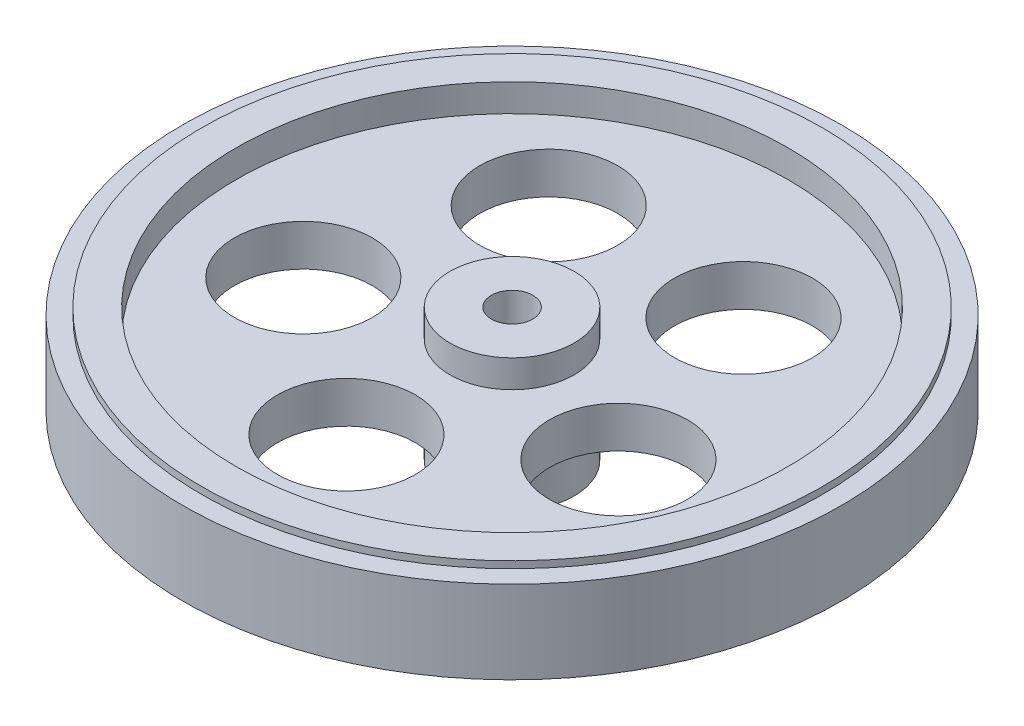
ISO-10303-21;
HEADER;
FILE_DESCRIPTION(('STEP AP214'),'2;1');
FILE_NAME('part.step','',(''),(''),'','','');
FILE_SCHEMA(('AUTOMOTIVE_DESIGN { 1 0 10303 214 1 1 1 1 }'));
ENDSEC;
DATA;
#1=APPLICATION_CONTEXT('core data for automotive mechanical design processes');
#2=APPLICATION_PROTOCOL_DEFINITION('international standard','automotive_design',2000,#1);
#3=PRODUCT_CONTEXT('',#1,'mechanical');
#4=PRODUCT('Part','Part','',(#3));
#5=PRODUCT_RELATED_PRODUCT_CATEGORY('part','',(#4));
#6=PRODUCT_DEFINITION_FORMATION('','',#4);
#7=PRODUCT_DEFINITION_CONTEXT('part definition',#1,'design');
#8=PRODUCT_DEFINITION('design','',#6,#7);
#9=PRODUCT_DEFINITION_SHAPE('','',#8);
#10=(LENGTH_UNIT() NAMED_UNIT(*) SI_UNIT(.MILLI.,.METRE.));
#11=(NAMED_UNIT(*) PLANE_ANGLE_UNIT() SI_UNIT($,.RADIAN.));
#12=(NAMED_UNIT(*) SI_UNIT($,.STERADIAN.) SOLID_ANGLE_UNIT());
#13=UNCERTAINTY_MEASURE_WITH_UNIT(LENGTH_MEASURE(1.E-05),#10,'distance_accuracy_value','');
#14=(GEOMETRIC_REPRESENTATION_CONTEXT(3) GLOBAL_UNCERTAINTY_ASSIGNED_CONTEXT((#13)) GLOBAL_UNIT_ASSIGNED_CONTEXT((#10,
#11,#12)) REPRESENTATION_CONTEXT('',''));
#15=CARTESIAN_POINT('',(0.,0.,0.));
#16=DIRECTION('',(0.,0.,1.));
#17=DIRECTION('',(1.,0.,0.));
#18=AXIS2_PLACEMENT_3D('',#15,#16,#17);
#19=CARTESIAN_POINT('',(-40.,33.92105263158,0.));
#20=DIRECTION('',(0.,-1.,0.));
#21=DIRECTION('',(0.,0.,-1.));
#22=AXIS2_PLACEMENT_3D('',#19,#20,#21);
#23=PLANE('',#22);
#24=CARTESIAN_POINT('',(0.,33.92105263158,0.));
#25=DIRECTION('',(0.,-1.,0.));
#26=DIRECTION('',(0.,0.,-1.));
#27=AXIS2_PLACEMENT_3D('',#24,#25,#26);
#28=CIRCLE('',#27,45.);
#29=CARTESIAN_POINT('',(0.,33.92105263158,-45.));
#30=VERTEX_POINT('',#29);
#31=EDGE_CURVE('E10',#30,#30,#28,.T.);
#32=ORIENTED_EDGE('',*,*,#31,.F.);
#33=EDGE_LOOP('',(#32));
#34=FACE_BOUND('',#33,.T.);
#35=CARTESIAN_POINT('',(0.,33.92105263158,0.));
#36=DIRECTION('',(0.,-1.,0.));
#37=DIRECTION('',(0.,0.,-1.));
#38=AXIS2_PLACEMENT_3D('',#35,#36,#37);
#39=CIRCLE('',#38,40.);
#40=CARTESIAN_POINT('',(0.,33.92105263158,-40.));
#41=VERTEX_POINT('',#40);
#42=EDGE_CURVE('E70',#41,#41,#39,.T.);
#43=ORIENTED_EDGE('',*,*,#42,.T.);
#44=EDGE_LOOP('',(#43));
#45=FACE_BOUND('',#44,.T.);
#46=ADVANCED_FACE('F40',(#34,#45),#23,.F.);
#47=CARTESIAN_POINT('',(0.,0.,0.));
#48=DIRECTION('',(0.,-1.,0.));
#49=DIRECTION('',(0.,0.,-1.));
#50=AXIS2_PLACEMENT_3D('',#47,#48,#49);
#51=CYLINDRICAL_SURFACE('',#50,45.);
#52=CARTESIAN_POINT('',(0.,32.92105263158,0.));
#53=DIRECTION('',(0.,-1.,0.));
#54=DIRECTION('',(0.,0.,-1.));
#55=AXIS2_PLACEMENT_3D('',#52,#53,#54);
#56=CIRCLE('',#55,45.);
#57=CARTESIAN_POINT('',(0.,32.92105263158,-45.));
#58=VERTEX_POINT('',#57);
#59=EDGE_CURVE('E47',#58,#58,#56,.T.);
#60=ORIENTED_EDGE('',*,*,#59,.F.);
#61=EDGE_LOOP('',(#60));
#62=FACE_BOUND('',#61,.T.);
#63=ORIENTED_EDGE('',*,*,#31,.T.);
#64=EDGE_LOOP('',(#63));
#65=FACE_BOUND('',#64,.T.);
#66=ADVANCED_FACE('F123',(#62,#65),#51,.T.);
#67=CARTESIAN_POINT('',(-45.,32.92105263158,0.));
#68=DIRECTION('',(0.,-1.,0.));
#69=DIRECTION('',(0.,0.,-1.));
#70=AXIS2_PLACEMENT_3D('',#67,#68,#69);
#71=PLANE('',#70);
#72=CARTESIAN_POINT('',(0.,32.92105263158,0.));
#73=DIRECTION('',(0.,-1.,0.));
#74=DIRECTION('',(0.,0.,-1.));
#75=AXIS2_PLACEMENT_3D('',#72,#73,#74);
#76=CIRCLE('',#75,47.75);
#77=CARTESIAN_POINT('',(0.,32.92105263158,-47.75));
#78=VERTEX_POINT('',#77);
#79=EDGE_CURVE('E52',#78,#78,#76,.T.);
#80=ORIENTED_EDGE('',*,*,#79,.F.);
#81=EDGE_LOOP('',(#80));
#82=FACE_BOUND('',#81,.T.);
#83=ORIENTED_EDGE('',*,*,#59,.T.);
#84=EDGE_LOOP('',(#83));
#85=FACE_BOUND('',#84,.T.);
#86=ADVANCED_FACE('F120',(#82,#85),#71,.F.);
#87=CARTESIAN_POINT('',(0.,0.,0.));
#88=DIRECTION('',(0.,-1.,0.));
#89=DIRECTION('',(0.,0.,-1.));
#90=AXIS2_PLACEMENT_3D('',#87,#88,#89);
#91=CYLINDRICAL_SURFACE('',#90,47.75);
#92=CARTESIAN_POINT('',(0.,20.92105263158,0.));
#93=DIRECTION('',(0.,-1.,0.));
#94=DIRECTION('',(0.,0.,-1.));
#95=AXIS2_PLACEMENT_3D('',#92,#93,#94);
#96=CIRCLE('',#95,47.75);
#97=CARTESIAN_POINT('',(0.,20.92105263158,-47.75));
#98=VERTEX_POINT('',#97);
#99=EDGE_CURVE('E113',#98,#98,#96,.T.);
#100=ORIENTED_EDGE('',*,*,#99,.F.);
#101=EDGE_LOOP('',(#100));
#102=FACE_BOUND('',#101,.T.);
#103=ORIENTED_EDGE('',*,*,#79,.T.);
#104=EDGE_LOOP('',(#103));
#105=FACE_BOUND('',#104,.T.);
#106=ADVANCED_FACE('F118',(#102,#105),#91,.T.);
#107=CARTESIAN_POINT('',(-47.75,20.92105263158,0.));
#108=DIRECTION('',(0.,1.,0.));
#109=DIRECTION('',(0.,0.,1.));
#110=AXIS2_PLACEMENT_3D('',#107,#108,#109);
#111=PLANE('',#110);
#112=CARTESIAN_POINT('',(0.,20.92105263158,0.));
#113=DIRECTION('',(0.,-1.,0.));
#114=DIRECTION('',(0.,0.,-1.));
#115=AXIS2_PLACEMENT_3D('',#112,#113,#114);
#116=CIRCLE('',#115,45.);
#117=CARTESIAN_POINT('',(0.,20.92105263158,-45.));
#118=VERTEX_POINT('',#117);
#119=EDGE_CURVE('E110',#118,#118,#116,.T.);
#120=ORIENTED_EDGE('',*,*,#119,.F.);
#121=EDGE_LOOP('',(#120));
#122=FACE_BOUND('',#121,.T.);
#123=ORIENTED_EDGE('',*,*,#99,.T.);
#124=EDGE_LOOP('',(#123));
#125=FACE_BOUND('',#124,.T.);
#126=ADVANCED_FACE('F135',(#122,#125),#111,.F.);
#127=CARTESIAN_POINT('',(0.,0.,0.));
#128=DIRECTION('',(0.,-1.,0.));
#129=DIRECTION('',(0.,0.,-1.));
#130=AXIS2_PLACEMENT_3D('',#127,#128,#129);
#131=CYLINDRICAL_SURFACE('',#130,45.);
#132=CARTESIAN_POINT('',(0.,19.92105263158,0.));
#133=DIRECTION('',(0.,-1.,0.));
#134=DIRECTION('',(0.,0.,-1.));
#135=AXIS2_PLACEMENT_3D('',#132,#133,#134);
#136=CIRCLE('',#135,45.);
#137=CARTESIAN_POINT('',(0.,19.92105263158,-45.));
#138=VERTEX_POINT('',#137);
#139=EDGE_CURVE('E107',#138,#138,#136,.T.);
#140=ORIENTED_EDGE('',*,*,#139,.F.);
#141=EDGE_LOOP('',(#140));
#142=FACE_BOUND('',#141,.T.);
#143=ORIENTED_EDGE('',*,*,#119,.T.);
#144=EDGE_LOOP('',(#143));
#145=FACE_BOUND('',#144,.T.);
#146=ADVANCED_FACE('F139',(#142,#145),#131,.T.);
#147=CARTESIAN_POINT('',(-45.,19.92105263158,0.));
#148=DIRECTION('',(0.,1.,0.));
#149=DIRECTION('',(0.,0.,1.));
#150=AXIS2_PLACEMENT_3D('',#147,#148,#149);
#151=PLANE('',#150);
#152=CARTESIAN_POINT('',(0.,19.92105263158,0.));
#153=DIRECTION('',(0.,-1.,0.));
#154=DIRECTION('',(0.,0.,-1.));
#155=AXIS2_PLACEMENT_3D('',#152,#153,#154);
#156=CIRCLE('',#155,40.);
#157=CARTESIAN_POINT('',(0.,19.92105263158,-40.));
#158=VERTEX_POINT('',#157);
#159=EDGE_CURVE('E104',#158,#158,#156,.T.);
#160=ORIENTED_EDGE('',*,*,#159,.F.);
#161=EDGE_LOOP('',(#160));
#162=FACE_BOUND('',#161,.T.);
#163=ORIENTED_EDGE('',*,*,#139,.T.);
#164=EDGE_LOOP('',(#163));
#165=FACE_BOUND('',#164,.T.);
#166=ADVANCED_FACE('F143',(#162,#165),#151,.F.);
#167=CARTESIAN_POINT('',(0.,0.,0.));
#168=DIRECTION('',(0.,-1.,0.));
#169=DIRECTION('',(0.,0.,-1.));
#170=AXIS2_PLACEMENT_3D('',#167,#168,#169);
#171=CYLINDRICAL_SURFACE('',#170,40.);
#172=CARTESIAN_POINT('',(0.,23.92105263158,0.));
#173=DIRECTION('',(0.,-1.,0.));
#174=DIRECTION('',(0.,0.,-1.));
#175=AXIS2_PLACEMENT_3D('',#172,#173,#174);
#176=CIRCLE('',#175,40.);
#177=CARTESIAN_POINT('',(0.,23.92105263158,-40.));
#178=VERTEX_POINT('',#177);
#179=EDGE_CURVE('E101',#178,#178,#176,.T.);
#180=ORIENTED_EDGE('',*,*,#179,.F.);
#181=EDGE_LOOP('',(#180));
#182=FACE_BOUND('',#181,.T.);
#183=ORIENTED_EDGE('',*,*,#159,.T.);
#184=EDGE_LOOP('',(#183));
#185=FACE_BOUND('',#184,.T.);
#186=ADVANCED_FACE('F147',(#182,#185),#171,.F.);
#187=CARTESIAN_POINT('',(-40.,23.92105263158,0.));
#188=DIRECTION('',(0.,1.,0.));
#189=DIRECTION('',(0.,0.,1.));
#190=AXIS2_PLACEMENT_3D('',#187,#188,#189);
#191=PLANE('',#190);
#192=CARTESIAN_POINT('',(-22.8253563910837,23.92105263158,7.41640786499874));
#193=DIRECTION('',(0.,-1.,0.));
#194=DIRECTION('',(0.,0.,-1.));
#195=AXIS2_PLACEMENT_3D('',#192,#193,#194);
#196=CIRCLE('',#195,10.);
#197=CARTESIAN_POINT('',(-22.8253563910837,23.92105263158,-2.58359213500126));
#198=VERTEX_POINT('',#197);
#199=EDGE_CURVE('E248',#198,#198,#196,.T.);
#200=ORIENTED_EDGE('',*,*,#199,.F.);
#201=EDGE_LOOP('',(#200));
#202=FACE_BOUND('',#201,.T.);
#203=CARTESIAN_POINT('',(-14.1068460550194,23.92105263158,-19.4164078649987));
#204=DIRECTION('',(0.,-1.,0.));
#205=DIRECTION('',(0.,0.,-1.));
#206=AXIS2_PLACEMENT_3D('',#203,#204,#205);
#207=CIRCLE('',#206,10.);
#208=CARTESIAN_POINT('',(-14.1068460550194,23.92105263158,-29.4164078649987));
#209=VERTEX_POINT('',#208);
#210=EDGE_CURVE('E244',#209,#209,#207,.T.);
#211=ORIENTED_EDGE('',*,*,#210,.F.);
#212=EDGE_LOOP('',(#211));
#213=FACE_BOUND('',#212,.T.);
#214=CARTESIAN_POINT('',(14.1068460550194,23.92105263158,-19.4164078649987));
#215=DIRECTION('',(0.,-1.,0.));
#216=DIRECTION('',(0.,0.,-1.));
#217=AXIS2_PLACEMENT_3D('',#214,#215,#216);
#218=CIRCLE('',#217,10.);
#219=CARTESIAN_POINT('',(14.1068460550194,23.92105263158,-29.4164078649987));
#220=VERTEX_POINT('',#219);
#221=EDGE_CURVE('E240',#220,#220,#218,.T.);
#222=ORIENTED_EDGE('',*,*,#221,.F.);
#223=EDGE_LOOP('',(#222));
#224=FACE_BOUND('',#223,.T.);
#225=CARTESIAN_POINT('',(22.8253563910837,23.92105263158,7.41640786499874));
#226=DIRECTION('',(0.,-1.,0.));
#227=DIRECTION('',(0.,0.,-1.));
#228=AXIS2_PLACEMENT_3D('',#225,#226,#227);
#229=CIRCLE('',#228,10.);
#230=CARTESIAN_POINT('',(22.8253563910837,23.92105263158,-2.58359213500127));
#231=VERTEX_POINT('',#230);
#232=EDGE_CURVE('E207',#231,#231,#229,.T.);
#233=ORIENTED_EDGE('',*,*,#232,.F.);
#234=EDGE_LOOP('',(#233));
#235=FACE_BOUND('',#234,.T.);
#236=CARTESIAN_POINT('',(0.,23.92105263158,24.));
#237=DIRECTION('',(0.,-1.,0.));
#238=DIRECTION('',(0.,0.,-1.));
#239=AXIS2_PLACEMENT_3D('',#236,#237,#238);
#240=CIRCLE('',#239,10.);
#241=CARTESIAN_POINT('',(0.,23.92105263158,14.));
#242=VERTEX_POINT('',#241);
#243=EDGE_CURVE('E60',#242,#242,#240,.T.);
#244=ORIENTED_EDGE('',*,*,#243,.F.);
#245=EDGE_LOOP('',(#244));
#246=FACE_BOUND('',#245,.T.);
#247=CARTESIAN_POINT('',(0.,23.92105263158,0.));
#248=DIRECTION('',(0.,-1.,0.));
#249=DIRECTION('',(0.,0.,-1.));
#250=AXIS2_PLACEMENT_3D('',#247,#248,#249);
#251=CIRCLE('',#250,9.);
#252=CARTESIAN_POINT('',(0.,23.92105263158,-9.));
#253=VERTEX_POINT('',#252);
#254=EDGE_CURVE('E98',#253,#253,#251,.T.);
#255=ORIENTED_EDGE('',*,*,#254,.F.);
#256=EDGE_LOOP('',(#255));
#257=FACE_BOUND('',#256,.T.);
#258=ORIENTED_EDGE('',*,*,#179,.T.);
#259=EDGE_LOOP('',(#258));
#260=FACE_BOUND('',#259,.T.);
#261=ADVANCED_FACE('F151',(#202,#213,#224,#235,#246,#257,#260),#191,.F.);
#262=CARTESIAN_POINT('',(0.,0.,0.));
#263=DIRECTION('',(0.,-1.,0.));
#264=DIRECTION('',(0.,0.,-1.));
#265=AXIS2_PLACEMENT_3D('',#262,#263,#264);
#266=CYLINDRICAL_SURFACE('',#265,9.);
#267=CARTESIAN_POINT('',(0.,14.72105263158,0.));
#268=DIRECTION('',(0.,-1.,0.));
#269=DIRECTION('',(0.,0.,-1.));
#270=AXIS2_PLACEMENT_3D('',#267,#268,#269);
#271=CIRCLE('',#270,9.);
#272=CARTESIAN_POINT('',(0.,14.72105263158,-9.));
#273=VERTEX_POINT('',#272);
#274=EDGE_CURVE('E95',#273,#273,#271,.T.);
#275=ORIENTED_EDGE('',*,*,#274,.F.);
#276=EDGE_LOOP('',(#275));
#277=FACE_BOUND('',#276,.T.);
#278=ORIENTED_EDGE('',*,*,#254,.T.);
#279=EDGE_LOOP('',(#278));
#280=FACE_BOUND('',#279,.T.);
#281=ADVANCED_FACE('F155',(#277,#280),#266,.T.);
#282=CARTESIAN_POINT('',(-9.,14.72105263158,0.));
#283=DIRECTION('',(0.,1.,0.));
#284=DIRECTION('',(0.,0.,1.));
#285=AXIS2_PLACEMENT_3D('',#282,#283,#284);
#286=PLANE('',#285);
#287=CARTESIAN_POINT('',(0.,14.72105263158,0.));
#288=DIRECTION('',(0.,-1.,0.));
#289=DIRECTION('',(0.,0.,-1.));
#290=AXIS2_PLACEMENT_3D('',#287,#288,#289);
#291=CIRCLE('',#290,3.);
#292=CARTESIAN_POINT('',(0.,14.72105263158,-3.));
#293=VERTEX_POINT('',#292);
#294=EDGE_CURVE('E92',#293,#293,#291,.T.);
#295=ORIENTED_EDGE('',*,*,#294,.F.);
#296=EDGE_LOOP('',(#295));
#297=FACE_BOUND('',#296,.T.);
#298=ORIENTED_EDGE('',*,*,#274,.T.);
#299=EDGE_LOOP('',(#298));
#300=FACE_BOUND('',#299,.T.);
#301=ADVANCED_FACE('F159',(#297,#300),#286,.F.);
#302=CARTESIAN_POINT('',(0.,0.,0.));
#303=DIRECTION('',(0.,-1.,0.));
#304=DIRECTION('',(0.,0.,-1.));
#305=AXIS2_PLACEMENT_3D('',#302,#303,#304);
#306=CYLINDRICAL_SURFACE('',#305,3.);
#307=CARTESIAN_POINT('',(0.,33.92105263158,0.));
#308=DIRECTION('',(0.,-1.,0.));
#309=DIRECTION('',(0.,0.,-1.));
#310=AXIS2_PLACEMENT_3D('',#307,#308,#309);
#311=CIRCLE('',#310,3.);
#312=CARTESIAN_POINT('',(0.,33.92105263158,-3.));
#313=VERTEX_POINT('',#312);
#314=EDGE_CURVE('E89',#313,#313,#311,.T.);
#315=ORIENTED_EDGE('',*,*,#314,.F.);
#316=EDGE_LOOP('',(#315));
#317=FACE_BOUND('',#316,.T.);
#318=ORIENTED_EDGE('',*,*,#294,.T.);
#319=EDGE_LOOP('',(#318));
#320=FACE_BOUND('',#319,.T.);
#321=ADVANCED_FACE('F163',(#317,#320),#306,.F.);
#322=CARTESIAN_POINT('',(-3.,33.92105263158,0.));
#323=DIRECTION('',(0.,-1.,0.));
#324=DIRECTION('',(0.,0.,-1.));
#325=AXIS2_PLACEMENT_3D('',#322,#323,#324);
#326=PLANE('',#325);
#327=CARTESIAN_POINT('',(0.,33.92105263158,0.));
#328=DIRECTION('',(0.,-1.,0.));
#329=DIRECTION('',(0.,0.,-1.));
#330=AXIS2_PLACEMENT_3D('',#327,#328,#329);
#331=CIRCLE('',#330,9.);
#332=CARTESIAN_POINT('',(0.,33.92105263158,-9.));
#333=VERTEX_POINT('',#332);
#334=EDGE_CURVE('E86',#333,#333,#331,.T.);
#335=ORIENTED_EDGE('',*,*,#334,.F.);
#336=EDGE_LOOP('',(#335));
#337=FACE_BOUND('',#336,.T.);
#338=ORIENTED_EDGE('',*,*,#314,.T.);
#339=EDGE_LOOP('',(#338));
#340=FACE_BOUND('',#339,.T.);
#341=ADVANCED_FACE('F167',(#337,#340),#326,.F.);
#342=CARTESIAN_POINT('',(0.,0.,0.));
#343=DIRECTION('',(0.,-1.,0.));
#344=DIRECTION('',(0.,0.,-1.));
#345=AXIS2_PLACEMENT_3D('',#342,#343,#344);
#346=CYLINDRICAL_SURFACE('',#345,9.);
#347=CARTESIAN_POINT('',(0.,29.92105263158,0.));
#348=DIRECTION('',(0.,-1.,0.));
#349=DIRECTION('',(0.,0.,-1.));
#350=AXIS2_PLACEMENT_3D('',#347,#348,#349);
#351=CIRCLE('',#350,9.);
#352=CARTESIAN_POINT('',(0.,29.92105263158,-9.));
#353=VERTEX_POINT('',#352);
#354=EDGE_CURVE('E79',#353,#353,#351,.T.);
#355=ORIENTED_EDGE('',*,*,#354,.F.);
#356=EDGE_LOOP('',(#355));
#357=FACE_BOUND('',#356,.T.);
#358=ORIENTED_EDGE('',*,*,#334,.T.);
#359=EDGE_LOOP('',(#358));
#360=FACE_BOUND('',#359,.T.);
#361=ADVANCED_FACE('F171',(#357,#360),#346,.T.);
#362=CARTESIAN_POINT('',(-40.,29.92105263158,0.));
#363=DIRECTION('',(0.,-1.,0.));
#364=DIRECTION('',(0.,0.,-1.));
#365=AXIS2_PLACEMENT_3D('',#362,#363,#364);
#366=PLANE('',#365);
#367=CARTESIAN_POINT('',(-22.8253563910837,29.92105263158,7.41640786499874));
#368=DIRECTION('',(0.,-1.,0.));
#369=DIRECTION('',(0.,0.,-1.));
#370=AXIS2_PLACEMENT_3D('',#367,#368,#369);
#371=CIRCLE('',#370,10.);
#372=CARTESIAN_POINT('',(-22.8253563910837,29.92105263158,-2.58359213500126));
#373=VERTEX_POINT('',#372);
#374=EDGE_CURVE('E43',#373,#373,#371,.T.);
#375=ORIENTED_EDGE('',*,*,#374,.T.);
#376=EDGE_LOOP('',(#375));
#377=FACE_BOUND('',#376,.T.);
#378=CARTESIAN_POINT('',(-14.1068460550194,29.92105263158,-19.4164078649987));
#379=DIRECTION('',(0.,-1.,0.));
#380=DIRECTION('',(0.,0.,-1.));
#381=AXIS2_PLACEMENT_3D('',#378,#379,#380);
#382=CIRCLE('',#381,10.);
#383=CARTESIAN_POINT('',(-14.1068460550194,29.92105263158,-29.4164078649987));
#384=VERTEX_POINT('',#383);
#385=EDGE_CURVE('E65',#384,#384,#382,.T.);
#386=ORIENTED_EDGE('',*,*,#385,.T.);
#387=EDGE_LOOP('',(#386));
#388=FACE_BOUND('',#387,.T.);
#389=CARTESIAN_POINT('',(14.1068460550194,29.92105263158,-19.4164078649987));
#390=DIRECTION('',(0.,-1.,0.));
#391=DIRECTION('',(0.,0.,-1.));
#392=AXIS2_PLACEMENT_3D('',#389,#390,#391);
#393=CIRCLE('',#392,10.);
#394=CARTESIAN_POINT('',(14.1068460550194,29.92105263158,-29.4164078649987));
#395=VERTEX_POINT('',#394);
#396=EDGE_CURVE('E63',#395,#395,#393,.T.);
#397=ORIENTED_EDGE('',*,*,#396,.T.);
#398=EDGE_LOOP('',(#397));
#399=FACE_BOUND('',#398,.T.);
#400=CARTESIAN_POINT('',(22.8253563910837,29.92105263158,7.41640786499874));
#401=DIRECTION('',(0.,-1.,0.));
#402=DIRECTION('',(0.,0.,-1.));
#403=AXIS2_PLACEMENT_3D('',#400,#401,#402);
#404=CIRCLE('',#403,10.);
#405=CARTESIAN_POINT('',(22.8253563910837,29.92105263158,-2.58359213500127));
#406=VERTEX_POINT('',#405);
#407=EDGE_CURVE('E59',#406,#406,#404,.T.);
#408=ORIENTED_EDGE('',*,*,#407,.T.);
#409=EDGE_LOOP('',(#408));
#410=FACE_BOUND('',#409,.T.);
#411=CARTESIAN_POINT('',(0.,29.92105263158,24.));
#412=DIRECTION('',(0.,-1.,0.));
#413=DIRECTION('',(0.,0.,-1.));
#414=AXIS2_PLACEMENT_3D('',#411,#412,#413);
#415=CIRCLE('',#414,10.);
#416=CARTESIAN_POINT('',(0.,29.92105263158,14.));
#417=VERTEX_POINT('',#416);
#418=EDGE_CURVE('E56',#417,#417,#415,.T.);
#419=ORIENTED_EDGE('',*,*,#418,.T.);
#420=EDGE_LOOP('',(#419));
#421=FACE_BOUND('',#420,.T.);
#422=CARTESIAN_POINT('',(0.,29.92105263158,0.));
#423=DIRECTION('',(0.,-1.,0.));
#424=DIRECTION('',(0.,0.,-1.));
#425=AXIS2_PLACEMENT_3D('',#422,#423,#424);
#426=CIRCLE('',#425,40.);
#427=CARTESIAN_POINT('',(0.,29.92105263158,-40.));
#428=VERTEX_POINT('',#427);
#429=EDGE_CURVE('E74',#428,#428,#426,.T.);
#430=ORIENTED_EDGE('',*,*,#429,.F.);
#431=EDGE_LOOP('',(#430));
#432=FACE_BOUND('',#431,.T.);
#433=ORIENTED_EDGE('',*,*,#354,.T.);
#434=EDGE_LOOP('',(#433));
#435=FACE_BOUND('',#434,.T.);
#436=ADVANCED_FACE('F175',(#377,#388,#399,#410,#421,#432,#435),#366,.F.);
#437=CARTESIAN_POINT('',(0.,0.,0.));
#438=DIRECTION('',(0.,-1.,0.));
#439=DIRECTION('',(0.,0.,-1.));
#440=AXIS2_PLACEMENT_3D('',#437,#438,#439);
#441=CYLINDRICAL_SURFACE('',#440,40.);
#442=ORIENTED_EDGE('',*,*,#42,.F.);
#443=EDGE_LOOP('',(#442));
#444=FACE_BOUND('',#443,.T.);
#445=ORIENTED_EDGE('',*,*,#429,.T.);
#446=EDGE_LOOP('',(#445));
#447=FACE_BOUND('',#446,.T.);
#448=ADVANCED_FACE('F179',(#444,#447),#441,.F.);
#449=CARTESIAN_POINT('',(0.,33.92105263158,24.));
#450=DIRECTION('',(0.,-1.,0.));
#451=DIRECTION('',(0.,0.,-1.));
#452=AXIS2_PLACEMENT_3D('',#449,#450,#451);
#453=CYLINDRICAL_SURFACE('',#452,10.);
#454=ORIENTED_EDGE('',*,*,#243,.T.);
#455=EDGE_LOOP('',(#454));
#456=FACE_BOUND('',#455,.T.);
#457=ORIENTED_EDGE('',*,*,#418,.F.);
#458=EDGE_LOOP('',(#457));
#459=FACE_BOUND('',#458,.T.);
#460=ADVANCED_FACE('F182',(#456,#459),#453,.F.);
#461=CARTESIAN_POINT('',(22.8253563910837,33.92105263158,7.41640786499874));
#462=DIRECTION('',(0.,-1.,0.));
#463=DIRECTION('',(0.,0.,-1.));
#464=AXIS2_PLACEMENT_3D('',#461,#462,#463);
#465=CYLINDRICAL_SURFACE('',#464,10.);
#466=ORIENTED_EDGE('',*,*,#232,.T.);
#467=EDGE_LOOP('',(#466));
#468=FACE_BOUND('',#467,.T.);
#469=ORIENTED_EDGE('',*,*,#407,.F.);
#470=EDGE_LOOP('',(#469));
#471=FACE_BOUND('',#470,.T.);
#472=ADVANCED_FACE('F186',(#468,#471),#465,.F.);
#473=CARTESIAN_POINT('',(14.1068460550194,33.92105263158,-19.4164078649987));
#474=DIRECTION('',(0.,-1.,0.));
#475=DIRECTION('',(0.,0.,-1.));
#476=AXIS2_PLACEMENT_3D('',#473,#474,#475);
#477=CYLINDRICAL_SURFACE('',#476,10.);
#478=ORIENTED_EDGE('',*,*,#221,.T.);
#479=EDGE_LOOP('',(#478));
#480=FACE_BOUND('',#479,.T.);
#481=ORIENTED_EDGE('',*,*,#396,.F.);
#482=EDGE_LOOP('',(#481));
#483=FACE_BOUND('',#482,.T.);
#484=ADVANCED_FACE('F195',(#480,#483),#477,.F.);
#485=CARTESIAN_POINT('',(-14.1068460550194,33.92105263158,-19.4164078649987));
#486=DIRECTION('',(0.,-1.,0.));
#487=DIRECTION('',(0.,0.,-1.));
#488=AXIS2_PLACEMENT_3D('',#485,#486,#487);
#489=CYLINDRICAL_SURFACE('',#488,10.);
#490=ORIENTED_EDGE('',*,*,#210,.T.);
#491=EDGE_LOOP('',(#490));
#492=FACE_BOUND('',#491,.T.);
#493=ORIENTED_EDGE('',*,*,#385,.F.);
#494=EDGE_LOOP('',(#493));
#495=FACE_BOUND('',#494,.T.);
#496=ADVANCED_FACE('F191',(#492,#495),#489,.F.);
#497=CARTESIAN_POINT('',(-22.8253563910837,33.92105263158,7.41640786499874));
#498=DIRECTION('',(0.,-1.,0.));
#499=DIRECTION('',(0.,0.,-1.));
#500=AXIS2_PLACEMENT_3D('',#497,#498,#499);
#501=CYLINDRICAL_SURFACE('',#500,10.);
#502=ORIENTED_EDGE('',*,*,#199,.T.);
#503=EDGE_LOOP('',(#502));
#504=FACE_BOUND('',#503,.T.);
#505=ORIENTED_EDGE('',*,*,#374,.F.);
#506=EDGE_LOOP('',(#505));
#507=FACE_BOUND('',#506,.T.);
#508=ADVANCED_FACE('F188',(#504,#507),#501,.F.);
#509=CLOSED_SHELL('',(#46,#66,#86,#106,#126,#146,#166,#186,#261,#281,#301,#321,#341,#361,#436,
#448,#460,#472,#484,#496,#508));
#510=MANIFOLD_SOLID_BREP('B2',#509);
#511=ADVANCED_BREP_SHAPE_REPRESENTATION('',(#18,#510),#14);
#512=SHAPE_DEFINITION_REPRESENTATION(#9,#511);
ENDSEC;
END-ISO-10303-21;
